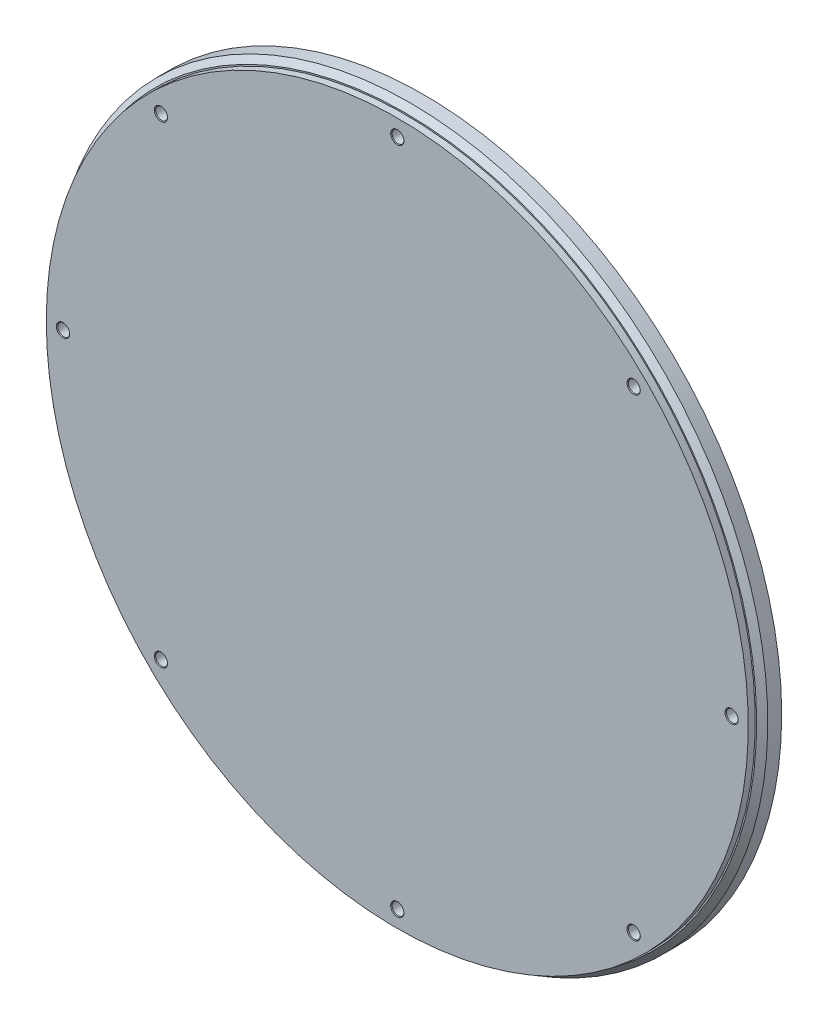
ISO-10303-21;
HEADER;
FILE_DESCRIPTION(('STEP AP214'),'2;1');
FILE_NAME('part.step','',(''),(''),'','','');
FILE_SCHEMA(('AUTOMOTIVE_DESIGN { 1 0 10303 214 1 1 1 1 }'));
ENDSEC;
DATA;
#1=APPLICATION_CONTEXT('core data for automotive mechanical design processes');
#2=APPLICATION_PROTOCOL_DEFINITION('international standard','automotive_design',2000,#1);
#3=PRODUCT_CONTEXT('',#1,'mechanical');
#4=PRODUCT('Part','Part','',(#3));
#5=PRODUCT_RELATED_PRODUCT_CATEGORY('part','',(#4));
#6=PRODUCT_DEFINITION_FORMATION('','',#4);
#7=PRODUCT_DEFINITION_CONTEXT('part definition',#1,'design');
#8=PRODUCT_DEFINITION('design','',#6,#7);
#9=PRODUCT_DEFINITION_SHAPE('','',#8);
#10=(LENGTH_UNIT() NAMED_UNIT(*) SI_UNIT(.MILLI.,.METRE.));
#11=(NAMED_UNIT(*) PLANE_ANGLE_UNIT() SI_UNIT($,.RADIAN.));
#12=(NAMED_UNIT(*) SI_UNIT($,.STERADIAN.) SOLID_ANGLE_UNIT());
#13=UNCERTAINTY_MEASURE_WITH_UNIT(LENGTH_MEASURE(1.E-05),#10,'distance_accuracy_value','');
#14=(GEOMETRIC_REPRESENTATION_CONTEXT(3) GLOBAL_UNCERTAINTY_ASSIGNED_CONTEXT((#13)) GLOBAL_UNIT_ASSIGNED_CONTEXT((#10,
#11,#12)) REPRESENTATION_CONTEXT('',''));
#15=CARTESIAN_POINT('',(0.,0.,0.));
#16=DIRECTION('',(0.,0.,1.));
#17=DIRECTION('',(1.,0.,0.));
#18=AXIS2_PLACEMENT_3D('',#15,#16,#17);
#19=CARTESIAN_POINT('',(0.,0.,8.40611909198));
#20=DIRECTION('',(0.,0.,-1.));
#21=DIRECTION('',(1.,0.,0.));
#22=AXIS2_PLACEMENT_3D('',#19,#20,#21);
#23=CONICAL_SURFACE('',#22,1.424104327826,1.02974425867665);
#24=DIRECTION('',(-0.857167300702112,0.,-0.515038074910054));
#25=VECTOR('',#24,1.);
#26=CARTESIAN_POINT('',(-1.424104327826,0.,8.40611909198));
#27=LINE('',#26,#25);
#28=CARTESIAN_POINT('',(0.,0.,9.261807299958));
#29=VERTEX_POINT('',#28);
#30=CARTESIAN_POINT('',(-2.1,0.,8.));
#31=VERTEX_POINT('',#30);
#32=EDGE_CURVE('E11',#29,#31,#27,.T.);
#33=ORIENTED_EDGE('',*,*,#32,.T.);
#34=CARTESIAN_POINT('',(0.,0.,8.));
#35=DIRECTION('',(0.,0.,-1.));
#36=DIRECTION('',(1.,0.,0.));
#37=AXIS2_PLACEMENT_3D('',#34,#35,#36);
#38=CIRCLE('',#37,2.1);
#39=EDGE_CURVE('E365',#31,#31,#38,.T.);
#40=ORIENTED_EDGE('',*,*,#39,.T.);
#41=ORIENTED_EDGE('',*,*,#32,.F.);
#42=EDGE_LOOP('',(#33,#40,#41));
#43=FACE_BOUND('',#42,.T.);
#44=ADVANCED_FACE('F17',(#43),#23,.F.);
#45=CARTESIAN_POINT('',(0.,0.,9.724897664956));
#46=DIRECTION('',(0.,0.,-1.));
#47=DIRECTION('',(1.,0.,0.));
#48=AXIS2_PLACEMENT_3D('',#45,#46,#47);
#49=CYLINDRICAL_SURFACE('',#48,2.1);
#50=ORIENTED_EDGE('',*,*,#39,.F.);
#51=DIRECTION('',(0.,0.,-1.));
#52=VECTOR('',#51,1.);
#53=CARTESIAN_POINT('',(-2.1,0.,9.724897664956));
#54=LINE('',#53,#52);
#55=CARTESIAN_POINT('',(-2.1,0.,0.));
#56=VERTEX_POINT('',#55);
#57=EDGE_CURVE('E28',#31,#56,#54,.T.);
#58=ORIENTED_EDGE('',*,*,#57,.T.);
#59=CARTESIAN_POINT('',(0.,0.,0.));
#60=DIRECTION('',(0.,0.,-1.));
#61=DIRECTION('',(1.,0.,0.));
#62=AXIS2_PLACEMENT_3D('',#59,#60,#61);
#63=CIRCLE('',#62,2.1);
#64=EDGE_CURVE('E399',#56,#56,#63,.T.);
#65=ORIENTED_EDGE('',*,*,#64,.T.);
#66=ORIENTED_EDGE('',*,*,#57,.F.);
#67=EDGE_LOOP('',(#50,#58,#65,#66));
#68=FACE_BOUND('',#67,.T.);
#69=ADVANCED_FACE('F934',(#68),#49,.F.);
#70=CARTESIAN_POINT('',(169.7056274848,-169.7056274848,5.947955742565));
#71=DIRECTION('',(0.,0.,1.));
#72=DIRECTION('',(-0.707106781186548,0.707106781186548,0.));
#73=AXIS2_PLACEMENT_3D('',#70,#71,#72);
#74=CONICAL_SURFACE('',#73,2.499104327826,1.02974425867665);
#75=DIRECTION('',(0.606108810937832,-0.606108810937832,0.515038074910054));
#76=VECTOR('',#75,1.);
#77=CARTESIAN_POINT('',(171.472761101898,-171.472761101898,5.947955742565));
#78=LINE('',#77,#76);
#79=CARTESIAN_POINT('',(169.7056274848,-169.7056274848,4.446342369133));
#80=VERTEX_POINT('',#79);
#81=CARTESIAN_POINT('',(172.710831304843,-172.710831304843,7.));
#82=VERTEX_POINT('',#81);
#83=EDGE_CURVE('E378',#80,#82,#78,.T.);
#84=ORIENTED_EDGE('',*,*,#83,.T.);
#85=CARTESIAN_POINT('',(169.7056274848,-169.7056274848,7.));
#86=DIRECTION('',(0.,0.,1.));
#87=DIRECTION('',(-0.707106781186548,0.707106781186548,0.));
#88=AXIS2_PLACEMENT_3D('',#85,#86,#87);
#89=CIRCLE('',#88,4.25);
#90=EDGE_CURVE('E372',#82,#82,#89,.T.);
#91=ORIENTED_EDGE('',*,*,#90,.T.);
#92=ORIENTED_EDGE('',*,*,#83,.F.);
#93=EDGE_LOOP('',(#84,#91,#92));
#94=FACE_BOUND('',#93,.T.);
#95=ADVANCED_FACE('F924',(#94),#74,.F.);
#96=CARTESIAN_POINT('',(169.7056274848,-169.7056274848,3.71865948759));
#97=DIRECTION('',(0.,0.,1.));
#98=DIRECTION('',(-0.707106781186548,0.707106781186548,0.));
#99=AXIS2_PLACEMENT_3D('',#96,#97,#98);
#100=CYLINDRICAL_SURFACE('',#99,4.25);
#101=ORIENTED_EDGE('',*,*,#90,.F.);
#102=DIRECTION('',(0.,0.,1.));
#103=VECTOR('',#102,1.);
#104=CARTESIAN_POINT('',(172.710831304843,-172.710831304843,3.71865948759));
#105=LINE('',#104,#103);
#106=CARTESIAN_POINT('',(172.7108313048,-172.7108313048,18.5));
#107=VERTEX_POINT('',#106);
#108=EDGE_CURVE('E381',#82,#107,#105,.T.);
#109=ORIENTED_EDGE('',*,*,#108,.T.);
#110=CARTESIAN_POINT('',(169.7056274848,-169.7056274848,18.5));
#111=DIRECTION('',(0.,0.,-1.));
#112=DIRECTION('',(-0.707106781186548,0.707106781186548,0.));
#113=AXIS2_PLACEMENT_3D('',#110,#111,#112);
#114=CIRCLE('',#113,4.25);
#115=CARTESIAN_POINT('',(169.7056274848,-165.455627484798,18.4999999999975));
#116=VERTEX_POINT('',#115);
#117=EDGE_CURVE('E357',#116,#107,#114,.T.);
#118=ORIENTED_EDGE('',*,*,#117,.F.);
#119=CARTESIAN_POINT('',(169.7056274848,-169.7056274848,18.5));
#120=DIRECTION('',(0.,0.,-1.));
#121=DIRECTION('',(-0.707106781186548,0.707106781186548,0.));
#122=AXIS2_PLACEMENT_3D('',#119,#120,#121);
#123=CIRCLE('',#122,4.25);
#124=EDGE_CURVE('E316',#107,#116,#123,.T.);
#125=ORIENTED_EDGE('',*,*,#124,.F.);
#126=ORIENTED_EDGE('',*,*,#108,.F.);
#127=EDGE_LOOP('',(#101,#109,#118,#125,#126));
#128=FACE_BOUND('',#127,.T.);
#129=ADVANCED_FACE('F915',(#128),#100,.F.);
#130=CARTESIAN_POINT('',(169.7056274848,-169.7056274848,18.74999999081));
#131=DIRECTION('',(0.,0.,1.));
#132=DIRECTION('',(0.,-1.,0.));
#133=AXIS2_PLACEMENT_3D('',#130,#131,#132);
#134=CONICAL_SURFACE('',#133,4.499999990815,0.785398163397448);
#135=ORIENTED_EDGE('',*,*,#124,.T.);
#136=DIRECTION('',(0.,0.707106781186548,0.707106781186548));
#137=VECTOR('',#136,1.);
#138=CARTESIAN_POINT('',(169.7056274848,-165.205627493985,18.74999999081));
#139=LINE('',#138,#137);
#140=CARTESIAN_POINT('',(169.7056274848,-164.955627484798,18.9999999999975));
#141=VERTEX_POINT('',#140);
#142=EDGE_CURVE('E320',#116,#141,#139,.T.);
#143=ORIENTED_EDGE('',*,*,#142,.T.);
#144=CARTESIAN_POINT('',(169.7056274848,-169.7056274848,19.));
#145=DIRECTION('',(0.,0.,-1.));
#146=DIRECTION('',(-0.707106781186548,0.707106781186548,0.));
#147=AXIS2_PLACEMENT_3D('',#144,#145,#146);
#148=CIRCLE('',#147,4.75);
#149=EDGE_CURVE('E310',#141,#141,#148,.T.);
#150=ORIENTED_EDGE('',*,*,#149,.F.);
#151=ORIENTED_EDGE('',*,*,#142,.F.);
#152=ORIENTED_EDGE('',*,*,#117,.T.);
#153=EDGE_LOOP('',(#135,#143,#150,#151,#152));
#154=FACE_BOUND('',#153,.T.);
#155=ADVANCED_FACE('F905',(#154),#134,.F.);
#156=CARTESIAN_POINT('',(0.,-240.,5.947955742565));
#157=DIRECTION('',(0.,0.,1.));
#158=DIRECTION('',(0.,1.,0.));
#159=AXIS2_PLACEMENT_3D('',#156,#157,#158);
#160=CONICAL_SURFACE('',#159,2.499104327826,1.02974425867665);
#161=DIRECTION('',(0.,-0.857167300702112,0.515038074910054));
#162=VECTOR('',#161,1.);
#163=CARTESIAN_POINT('',(0.,-242.499104327826,5.947955742565));
#164=LINE('',#163,#162);
#165=CARTESIAN_POINT('',(0.,-240.,4.446342369133));
#166=VERTEX_POINT('',#165);
#167=CARTESIAN_POINT('',(0.,-244.25,7.));
#168=VERTEX_POINT('',#167);
#169=EDGE_CURVE('E290',#166,#168,#164,.T.);
#170=ORIENTED_EDGE('',*,*,#169,.T.);
#171=CARTESIAN_POINT('',(0.,-240.,7.));
#172=DIRECTION('',(0.,0.,1.));
#173=DIRECTION('',(0.,1.,0.));
#174=AXIS2_PLACEMENT_3D('',#171,#172,#173);
#175=CIRCLE('',#174,4.25);
#176=EDGE_CURVE('E291',#168,#168,#175,.T.);
#177=ORIENTED_EDGE('',*,*,#176,.T.);
#178=ORIENTED_EDGE('',*,*,#169,.F.);
#179=EDGE_LOOP('',(#170,#177,#178));
#180=FACE_BOUND('',#179,.T.);
#181=ADVANCED_FACE('F896',(#180),#160,.F.);
#182=CARTESIAN_POINT('',(0.,-240.,3.71865948759));
#183=DIRECTION('',(0.,0.,1.));
#184=DIRECTION('',(0.,1.,0.));
#185=AXIS2_PLACEMENT_3D('',#182,#183,#184);
#186=CYLINDRICAL_SURFACE('',#185,4.25);
#187=ORIENTED_EDGE('',*,*,#176,.F.);
#188=DIRECTION('',(0.,0.,1.));
#189=VECTOR('',#188,1.);
#190=CARTESIAN_POINT('',(0.,-244.25,3.71865948759));
#191=LINE('',#190,#189);
#192=CARTESIAN_POINT('',(0.,-244.25,18.5));
#193=VERTEX_POINT('',#192);
#194=EDGE_CURVE('E287',#168,#193,#191,.T.);
#195=ORIENTED_EDGE('',*,*,#194,.T.);
#196=CARTESIAN_POINT('',(0.,-240.,18.5));
#197=DIRECTION('',(0.,0.,-1.));
#198=DIRECTION('',(0.,1.,0.));
#199=AXIS2_PLACEMENT_3D('',#196,#197,#198);
#200=CIRCLE('',#199,4.25);
#201=CARTESIAN_POINT('',(0.,-235.75,18.4999999999985));
#202=VERTEX_POINT('',#201);
#203=EDGE_CURVE('E344',#202,#193,#200,.T.);
#204=ORIENTED_EDGE('',*,*,#203,.F.);
#205=CARTESIAN_POINT('',(0.,-240.,18.5));
#206=DIRECTION('',(0.,0.,-1.));
#207=DIRECTION('',(0.,1.,0.));
#208=AXIS2_PLACEMENT_3D('',#205,#206,#207);
#209=CIRCLE('',#208,4.25);
#210=EDGE_CURVE('E412',#193,#202,#209,.T.);
#211=ORIENTED_EDGE('',*,*,#210,.F.);
#212=ORIENTED_EDGE('',*,*,#194,.F.);
#213=EDGE_LOOP('',(#187,#195,#204,#211,#212));
#214=FACE_BOUND('',#213,.T.);
#215=ADVANCED_FACE('F886',(#214),#186,.F.);
#216=CARTESIAN_POINT('',(0.,-240.,18.74999988051));
#217=DIRECTION('',(0.,0.,1.));
#218=DIRECTION('',(0.,-1.,0.));
#219=AXIS2_PLACEMENT_3D('',#216,#217,#218);
#220=CONICAL_SURFACE('',#219,4.499999880513,0.785398163397448);
#221=ORIENTED_EDGE('',*,*,#210,.T.);
#222=DIRECTION('',(0.,0.707106781186548,0.707106781186548));
#223=VECTOR('',#222,1.);
#224=CARTESIAN_POINT('',(0.,-235.500000119487,18.74999988051));
#225=LINE('',#224,#223);
#226=CARTESIAN_POINT('',(0.,-235.25,18.9999999999985));
#227=VERTEX_POINT('',#226);
#228=EDGE_CURVE('E408',#202,#227,#225,.T.);
#229=ORIENTED_EDGE('',*,*,#228,.T.);
#230=CARTESIAN_POINT('',(0.,-240.,19.));
#231=DIRECTION('',(0.,0.,-1.));
#232=DIRECTION('',(0.,1.,0.));
#233=AXIS2_PLACEMENT_3D('',#230,#231,#232);
#234=CIRCLE('',#233,4.75);
#235=EDGE_CURVE('E315',#227,#227,#234,.T.);
#236=ORIENTED_EDGE('',*,*,#235,.F.);
#237=ORIENTED_EDGE('',*,*,#228,.F.);
#238=ORIENTED_EDGE('',*,*,#203,.T.);
#239=EDGE_LOOP('',(#221,#229,#236,#237,#238));
#240=FACE_BOUND('',#239,.T.);
#241=ADVANCED_FACE('F459',(#240),#220,.F.);
#242=CARTESIAN_POINT('',(-169.7056274848,-169.7056274848,5.947955742565));
#243=DIRECTION('',(0.,0.,1.));
#244=DIRECTION('',(0.707106781186548,0.707106781186548,0.));
#245=AXIS2_PLACEMENT_3D('',#242,#243,#244);
#246=CONICAL_SURFACE('',#245,2.499104327826,1.02974425867665);
#247=DIRECTION('',(-0.606108810937832,-0.606108810937832,0.515038074910054));
#248=VECTOR('',#247,1.);
#249=CARTESIAN_POINT('',(-171.472761101898,-171.472761101898,5.947955742565));
#250=LINE('',#249,#248);
#251=CARTESIAN_POINT('',(-169.7056274848,-169.7056274848,4.446342369133));
#252=VERTEX_POINT('',#251);
#253=CARTESIAN_POINT('',(-172.710831304843,-172.710831304843,7.));
#254=VERTEX_POINT('',#253);
#255=EDGE_CURVE('E376',#252,#254,#250,.T.);
#256=ORIENTED_EDGE('',*,*,#255,.T.);
#257=CARTESIAN_POINT('',(-169.7056274848,-169.7056274848,7.));
#258=DIRECTION('',(0.,0.,1.));
#259=DIRECTION('',(0.707106781186548,0.707106781186548,0.));
#260=AXIS2_PLACEMENT_3D('',#257,#258,#259);
#261=CIRCLE('',#260,4.25);
#262=EDGE_CURVE('E377',#254,#254,#261,.T.);
#263=ORIENTED_EDGE('',*,*,#262,.T.);
#264=ORIENTED_EDGE('',*,*,#255,.F.);
#265=EDGE_LOOP('',(#256,#263,#264));
#266=FACE_BOUND('',#265,.T.);
#267=ADVANCED_FACE('F867',(#266),#246,.F.);
#268=CARTESIAN_POINT('',(-169.7056274848,-169.7056274848,3.71865948759));
#269=DIRECTION('',(0.,0.,1.));
#270=DIRECTION('',(0.707106781186548,0.707106781186548,0.));
#271=AXIS2_PLACEMENT_3D('',#268,#269,#270);
#272=CYLINDRICAL_SURFACE('',#271,4.25);
#273=ORIENTED_EDGE('',*,*,#262,.F.);
#274=DIRECTION('',(0.,0.,1.));
#275=VECTOR('',#274,1.);
#276=CARTESIAN_POINT('',(-172.710831304843,-172.710831304843,3.71865948759));
#277=LINE('',#276,#275);
#278=CARTESIAN_POINT('',(-172.7108313048,-172.7108313048,18.5));
#279=VERTEX_POINT('',#278);
#280=EDGE_CURVE('E373',#254,#279,#277,.T.);
#281=ORIENTED_EDGE('',*,*,#280,.T.);
#282=CARTESIAN_POINT('',(-169.7056274848,-169.7056274848,18.5));
#283=DIRECTION('',(0.,0.,-1.));
#284=DIRECTION('',(0.707106781186548,0.707106781186548,0.));
#285=AXIS2_PLACEMENT_3D('',#282,#283,#284);
#286=CIRCLE('',#285,4.25);
#287=CARTESIAN_POINT('',(-169.7056274848,-165.455627484798,18.4999999999975));
#288=VERTEX_POINT('',#287);
#289=EDGE_CURVE('E339',#288,#279,#286,.T.);
#290=ORIENTED_EDGE('',*,*,#289,.F.);
#291=CARTESIAN_POINT('',(-169.7056274848,-169.7056274848,18.5));
#292=DIRECTION('',(0.,0.,-1.));
#293=DIRECTION('',(0.707106781186548,0.707106781186548,0.));
#294=AXIS2_PLACEMENT_3D('',#291,#292,#293);
#295=CIRCLE('',#294,4.25);
#296=EDGE_CURVE('E340',#279,#288,#295,.T.);
#297=ORIENTED_EDGE('',*,*,#296,.F.);
#298=ORIENTED_EDGE('',*,*,#280,.F.);
#299=EDGE_LOOP('',(#273,#281,#290,#297,#298));
#300=FACE_BOUND('',#299,.T.);
#301=ADVANCED_FACE('F856',(#300),#272,.F.);
#302=CARTESIAN_POINT('',(-169.7056274848,-169.7056274848,18.74999999081));
#303=DIRECTION('',(0.,0.,1.));
#304=DIRECTION('',(0.,-1.,0.));
#305=AXIS2_PLACEMENT_3D('',#302,#303,#304);
#306=CONICAL_SURFACE('',#305,4.499999990815,0.785398163397448);
#307=ORIENTED_EDGE('',*,*,#296,.T.);
#308=DIRECTION('',(0.,0.707106781186548,0.707106781186548));
#309=VECTOR('',#308,1.);
#310=CARTESIAN_POINT('',(-169.7056274848,-165.205627493985,18.74999999081));
#311=LINE('',#310,#309);
#312=CARTESIAN_POINT('',(-169.7056274848,-164.955627484798,18.9999999999975));
#313=VERTEX_POINT('',#312);
#314=EDGE_CURVE('E336',#288,#313,#311,.T.);
#315=ORIENTED_EDGE('',*,*,#314,.T.);
#316=CARTESIAN_POINT('',(-169.7056274848,-169.7056274848,19.));
#317=DIRECTION('',(0.,0.,-1.));
#318=DIRECTION('',(0.707106781186548,0.707106781186548,0.));
#319=AXIS2_PLACEMENT_3D('',#316,#317,#318);
#320=CIRCLE('',#319,4.75);
#321=EDGE_CURVE('E296',#313,#313,#320,.T.);
#322=ORIENTED_EDGE('',*,*,#321,.F.);
#323=ORIENTED_EDGE('',*,*,#314,.F.);
#324=ORIENTED_EDGE('',*,*,#289,.T.);
#325=EDGE_LOOP('',(#307,#315,#322,#323,#324));
#326=FACE_BOUND('',#325,.T.);
#327=ADVANCED_FACE('F844',(#326),#306,.F.);
#328=CARTESIAN_POINT('',(-240.,0.,5.947955742565));
#329=DIRECTION('',(0.,0.,1.));
#330=DIRECTION('',(1.,0.,0.));
#331=AXIS2_PLACEMENT_3D('',#328,#329,#330);
#332=CONICAL_SURFACE('',#331,2.499104327826,1.02974425867665);
#333=DIRECTION('',(-0.857167300702112,0.,0.515038074910054));
#334=VECTOR('',#333,1.);
#335=CARTESIAN_POINT('',(-242.499104327826,0.,5.947955742565));
#336=LINE('',#335,#334);
#337=CARTESIAN_POINT('',(-240.,0.,4.446342369133));
#338=VERTEX_POINT('',#337);
#339=CARTESIAN_POINT('',(-244.25,0.,7.));
#340=VERTEX_POINT('',#339);
#341=EDGE_CURVE('E360',#338,#340,#336,.T.);
#342=ORIENTED_EDGE('',*,*,#341,.T.);
#343=CARTESIAN_POINT('',(-240.,0.,7.));
#344=DIRECTION('',(0.,0.,-1.));
#345=DIRECTION('',(1.,0.,0.));
#346=AXIS2_PLACEMENT_3D('',#343,#344,#345);
#347=CIRCLE('',#346,4.25);
#348=EDGE_CURVE('E298',#340,#340,#347,.T.);
#349=ORIENTED_EDGE('',*,*,#348,.F.);
#350=ORIENTED_EDGE('',*,*,#341,.F.);
#351=EDGE_LOOP('',(#342,#349,#350));
#352=FACE_BOUND('',#351,.T.);
#353=ADVANCED_FACE('F833',(#352),#332,.F.);
#354=CARTESIAN_POINT('',(-240.,0.,3.71865948759));
#355=DIRECTION('',(0.,0.,1.));
#356=DIRECTION('',(1.,0.,0.));
#357=AXIS2_PLACEMENT_3D('',#354,#355,#356);
#358=CYLINDRICAL_SURFACE('',#357,4.25);
#359=ORIENTED_EDGE('',*,*,#348,.T.);
#360=DIRECTION('',(0.,0.,1.));
#361=VECTOR('',#360,1.);
#362=CARTESIAN_POINT('',(-244.25,0.,3.71865948759));
#363=LINE('',#362,#361);
#364=CARTESIAN_POINT('',(-244.25,0.,18.5));
#365=VERTEX_POINT('',#364);
#366=EDGE_CURVE('E302',#340,#365,#363,.T.);
#367=ORIENTED_EDGE('',*,*,#366,.T.);
#368=CARTESIAN_POINT('',(-240.,0.,18.5));
#369=DIRECTION('',(0.,0.,-1.));
#370=DIRECTION('',(-1.,0.,0.));
#371=AXIS2_PLACEMENT_3D('',#368,#369,#370);
#372=CIRCLE('',#371,4.25);
#373=CARTESIAN_POINT('',(-240.,4.25000000000152,18.4999999999985));
#374=VERTEX_POINT('',#373);
#375=EDGE_CURVE('E325',#374,#365,#372,.T.);
#376=ORIENTED_EDGE('',*,*,#375,.F.);
#377=CARTESIAN_POINT('',(-240.,0.,18.5));
#378=DIRECTION('',(0.,0.,-1.));
#379=DIRECTION('',(-1.,0.,0.));
#380=AXIS2_PLACEMENT_3D('',#377,#378,#379);
#381=CIRCLE('',#380,4.25);
#382=EDGE_CURVE('E328',#365,#374,#381,.T.);
#383=ORIENTED_EDGE('',*,*,#382,.F.);
#384=ORIENTED_EDGE('',*,*,#366,.F.);
#385=EDGE_LOOP('',(#359,#367,#376,#383,#384));
#386=FACE_BOUND('',#385,.T.);
#387=ADVANCED_FACE('F823',(#386),#358,.F.);
#388=CARTESIAN_POINT('',(-240.,0.,18.74999988051));
#389=DIRECTION('',(0.,0.,1.));
#390=DIRECTION('',(0.,-1.,0.));
#391=AXIS2_PLACEMENT_3D('',#388,#389,#390);
#392=CONICAL_SURFACE('',#391,4.499999880513,0.785398163397448);
#393=ORIENTED_EDGE('',*,*,#375,.T.);
#394=ORIENTED_EDGE('',*,*,#382,.T.);
#395=DIRECTION('',(0.,0.707106781186548,0.707106781186548));
#396=VECTOR('',#395,1.);
#397=CARTESIAN_POINT('',(-240.,4.49999988051302,18.74999988051));
#398=LINE('',#397,#396);
#399=CARTESIAN_POINT('',(-240.,4.75000000000153,18.9999999999985));
#400=VERTEX_POINT('',#399);
#401=EDGE_CURVE('E303',#374,#400,#398,.T.);
#402=ORIENTED_EDGE('',*,*,#401,.T.);
#403=CARTESIAN_POINT('',(-240.,0.,19.));
#404=DIRECTION('',(0.,0.,-1.));
#405=DIRECTION('',(-1.,0.,0.));
#406=AXIS2_PLACEMENT_3D('',#403,#404,#405);
#407=CIRCLE('',#406,4.75);
#408=EDGE_CURVE('E292',#400,#400,#407,.T.);
#409=ORIENTED_EDGE('',*,*,#408,.F.);
#410=ORIENTED_EDGE('',*,*,#401,.F.);
#411=EDGE_LOOP('',(#393,#394,#402,#409,#410));
#412=FACE_BOUND('',#411,.T.);
#413=ADVANCED_FACE('F813',(#412),#392,.F.);
#414=CARTESIAN_POINT('',(-169.7056274848,169.7056274848,5.947955742565));
#415=DIRECTION('',(0.,0.,1.));
#416=DIRECTION('',(0.707106781186548,-0.707106781186548,0.));
#417=AXIS2_PLACEMENT_3D('',#414,#415,#416);
#418=CONICAL_SURFACE('',#417,2.499104327826,1.02974425867665);
#419=DIRECTION('',(-0.606108810937832,0.606108810937832,0.515038074910054));
#420=VECTOR('',#419,1.);
#421=CARTESIAN_POINT('',(-171.472761101898,171.472761101898,5.947955742565));
#422=LINE('',#421,#420);
#423=CARTESIAN_POINT('',(-169.7056274848,169.7056274848,4.446342369133));
#424=VERTEX_POINT('',#423);
#425=CARTESIAN_POINT('',(-172.7108313048,172.7108313048,7.));
#426=VERTEX_POINT('',#425);
#427=EDGE_CURVE('E329',#424,#426,#422,.T.);
#428=ORIENTED_EDGE('',*,*,#427,.T.);
#429=CARTESIAN_POINT('',(-169.7056274848,169.7056274848,7.));
#430=DIRECTION('',(0.,0.,-1.));
#431=DIRECTION('',(0.707106781186548,-0.707106781186548,0.));
#432=AXIS2_PLACEMENT_3D('',#429,#430,#431);
#433=CIRCLE('',#432,4.25);
#434=EDGE_CURVE('E274',#426,#426,#433,.T.);
#435=ORIENTED_EDGE('',*,*,#434,.F.);
#436=ORIENTED_EDGE('',*,*,#427,.F.);
#437=EDGE_LOOP('',(#428,#435,#436));
#438=FACE_BOUND('',#437,.T.);
#439=ADVANCED_FACE('F802',(#438),#418,.F.);
#440=CARTESIAN_POINT('',(-169.7056274848,169.7056274848,3.71865948759));
#441=DIRECTION('',(0.,0.,1.));
#442=DIRECTION('',(0.707106781186548,-0.707106781186548,0.));
#443=AXIS2_PLACEMENT_3D('',#440,#441,#442);
#444=CYLINDRICAL_SURFACE('',#443,4.25);
#445=ORIENTED_EDGE('',*,*,#434,.T.);
#446=DIRECTION('',(0.,0.,1.));
#447=VECTOR('',#446,1.);
#448=CARTESIAN_POINT('',(-172.710831304843,172.710831304843,3.71865948759));
#449=LINE('',#448,#447);
#450=CARTESIAN_POINT('',(-172.710831304843,172.710831304843,18.5));
#451=VERTEX_POINT('',#450);
#452=EDGE_CURVE('E345',#426,#451,#449,.T.);
#453=ORIENTED_EDGE('',*,*,#452,.T.);
#454=CARTESIAN_POINT('',(-169.7056274848,169.7056274848,18.5));
#455=DIRECTION('',(0.,0.,-1.));
#456=DIRECTION('',(-0.707106781186548,0.707106781186548,0.));
#457=AXIS2_PLACEMENT_3D('',#454,#455,#456);
#458=CIRCLE('',#457,4.25);
#459=CARTESIAN_POINT('',(-169.7056274848,173.955627484803,18.4999999999975));
#460=VERTEX_POINT('',#459);
#461=EDGE_CURVE('E281',#460,#451,#458,.T.);
#462=ORIENTED_EDGE('',*,*,#461,.F.);
#463=CARTESIAN_POINT('',(-169.7056274848,169.7056274848,18.5));
#464=DIRECTION('',(0.,0.,-1.));
#465=DIRECTION('',(-0.707106781186548,0.707106781186548,0.));
#466=AXIS2_PLACEMENT_3D('',#463,#464,#465);
#467=CIRCLE('',#466,4.25);
#468=EDGE_CURVE('E284',#451,#460,#467,.T.);
#469=ORIENTED_EDGE('',*,*,#468,.F.);
#470=ORIENTED_EDGE('',*,*,#452,.F.);
#471=EDGE_LOOP('',(#445,#453,#462,#469,#470));
#472=FACE_BOUND('',#471,.T.);
#473=ADVANCED_FACE('F791',(#472),#444,.F.);
#474=CARTESIAN_POINT('',(-169.7056274848,169.7056274848,18.74999999081));
#475=DIRECTION('',(0.,0.,1.));
#476=DIRECTION('',(0.,-1.,0.));
#477=AXIS2_PLACEMENT_3D('',#474,#475,#476);
#478=CONICAL_SURFACE('',#477,4.499999990815,0.785398163397448);
#479=ORIENTED_EDGE('',*,*,#461,.T.);
#480=ORIENTED_EDGE('',*,*,#468,.T.);
#481=DIRECTION('',(0.,0.707106781186548,0.707106781186548));
#482=VECTOR('',#481,1.);
#483=CARTESIAN_POINT('',(-169.7056274848,174.205627475615,18.74999999081));
#484=LINE('',#483,#482);
#485=CARTESIAN_POINT('',(-169.7056274848,174.455627484803,18.9999999999975));
#486=VERTEX_POINT('',#485);
#487=EDGE_CURVE('E307',#460,#486,#484,.T.);
#488=ORIENTED_EDGE('',*,*,#487,.T.);
#489=CARTESIAN_POINT('',(-169.7056274848,169.7056274848,19.));
#490=DIRECTION('',(0.,0.,-1.));
#491=DIRECTION('',(-0.707106781186548,0.707106781186548,0.));
#492=AXIS2_PLACEMENT_3D('',#489,#490,#491);
#493=CIRCLE('',#492,4.75);
#494=EDGE_CURVE('E297',#486,#486,#493,.T.);
#495=ORIENTED_EDGE('',*,*,#494,.F.);
#496=ORIENTED_EDGE('',*,*,#487,.F.);
#497=EDGE_LOOP('',(#479,#480,#488,#495,#496));
#498=FACE_BOUND('',#497,.T.);
#499=ADVANCED_FACE('F780',(#498),#478,.F.);
#500=CARTESIAN_POINT('',(0.,240.,5.947955742565));
#501=DIRECTION('',(0.,0.,1.));
#502=DIRECTION('',(0.,-1.,0.));
#503=AXIS2_PLACEMENT_3D('',#500,#501,#502);
#504=CONICAL_SURFACE('',#503,2.499104327826,1.02974425867665);
#505=DIRECTION('',(0.,0.857167300702112,0.515038074910054));
#506=VECTOR('',#505,1.);
#507=CARTESIAN_POINT('',(0.,242.499104327826,5.947955742565));
#508=LINE('',#507,#506);
#509=CARTESIAN_POINT('',(0.,240.,4.446342369133));
#510=VERTEX_POINT('',#509);
#511=CARTESIAN_POINT('',(0.,244.25,7.));
#512=VERTEX_POINT('',#511);
#513=EDGE_CURVE('E285',#510,#512,#508,.T.);
#514=ORIENTED_EDGE('',*,*,#513,.T.);
#515=CARTESIAN_POINT('',(0.,240.,7.));
#516=DIRECTION('',(0.,0.,-1.));
#517=DIRECTION('',(0.,-1.,0.));
#518=AXIS2_PLACEMENT_3D('',#515,#516,#517);
#519=CIRCLE('',#518,4.25);
#520=EDGE_CURVE('E351',#512,#512,#519,.T.);
#521=ORIENTED_EDGE('',*,*,#520,.F.);
#522=ORIENTED_EDGE('',*,*,#513,.F.);
#523=EDGE_LOOP('',(#514,#521,#522));
#524=FACE_BOUND('',#523,.T.);
#525=ADVANCED_FACE('F771',(#524),#504,.F.);
#526=CARTESIAN_POINT('',(0.,240.,3.71865948759));
#527=DIRECTION('',(0.,0.,1.));
#528=DIRECTION('',(0.,-1.,0.));
#529=AXIS2_PLACEMENT_3D('',#526,#527,#528);
#530=CYLINDRICAL_SURFACE('',#529,4.25);
#531=ORIENTED_EDGE('',*,*,#520,.T.);
#532=DIRECTION('',(0.,0.,1.));
#533=VECTOR('',#532,1.);
#534=CARTESIAN_POINT('',(0.,244.25,3.71865948759));
#535=LINE('',#534,#533);
#536=CARTESIAN_POINT('',(0.,244.25,18.4999999999985));
#537=VERTEX_POINT('',#536);
#538=EDGE_CURVE('E350',#512,#537,#535,.T.);
#539=ORIENTED_EDGE('',*,*,#538,.T.);
#540=CARTESIAN_POINT('',(0.,240.,18.5));
#541=DIRECTION('',(0.,0.,-1.));
#542=DIRECTION('',(0.,1.,0.));
#543=AXIS2_PLACEMENT_3D('',#540,#541,#542);
#544=CIRCLE('',#543,4.25);
#545=EDGE_CURVE('E276',#537,#537,#544,.T.);
#546=ORIENTED_EDGE('',*,*,#545,.F.);
#547=ORIENTED_EDGE('',*,*,#538,.F.);
#548=EDGE_LOOP('',(#531,#539,#546,#547));
#549=FACE_BOUND('',#548,.T.);
#550=ADVANCED_FACE('F496',(#549),#530,.F.);
#551=CARTESIAN_POINT('',(0.,240.,18.74999988051));
#552=DIRECTION('',(0.,0.,1.));
#553=DIRECTION('',(0.,-1.,0.));
#554=AXIS2_PLACEMENT_3D('',#551,#552,#553);
#555=CONICAL_SURFACE('',#554,4.499999880513,0.785398163397448);
#556=ORIENTED_EDGE('',*,*,#545,.T.);
#557=DIRECTION('',(0.,0.707106781186548,0.707106781186548));
#558=VECTOR('',#557,1.);
#559=CARTESIAN_POINT('',(0.,244.499999880513,18.74999988051));
#560=LINE('',#559,#558);
#561=CARTESIAN_POINT('',(0.,244.75,18.9999999999985));
#562=VERTEX_POINT('',#561);
#563=EDGE_CURVE('E280',#537,#562,#560,.T.);
#564=ORIENTED_EDGE('',*,*,#563,.T.);
#565=CARTESIAN_POINT('',(0.,240.,19.));
#566=DIRECTION('',(0.,0.,-1.));
#567=DIRECTION('',(0.,1.,0.));
#568=AXIS2_PLACEMENT_3D('',#565,#566,#567);
#569=CIRCLE('',#568,4.75);
#570=EDGE_CURVE('E331',#562,#562,#569,.T.);
#571=ORIENTED_EDGE('',*,*,#570,.F.);
#572=ORIENTED_EDGE('',*,*,#563,.F.);
#573=EDGE_LOOP('',(#556,#564,#571,#572));
#574=FACE_BOUND('',#573,.T.);
#575=ADVANCED_FACE('F500',(#574),#555,.F.);
#576=CARTESIAN_POINT('',(169.7056274848,169.7056274848,5.947955742565));
#577=DIRECTION('',(0.,0.,1.));
#578=DIRECTION('',(-0.707106781186548,-0.707106781186548,0.));
#579=AXIS2_PLACEMENT_3D('',#576,#577,#578);
#580=CONICAL_SURFACE('',#579,2.499104327826,1.02974425867665);
#581=DIRECTION('',(0.606108810937832,0.606108810937832,0.515038074910054));
#582=VECTOR('',#581,1.);
#583=CARTESIAN_POINT('',(171.472761101898,171.472761101898,5.947955742565));
#584=LINE('',#583,#582);
#585=CARTESIAN_POINT('',(169.7056274848,169.7056274848,4.446342369133));
#586=VERTEX_POINT('',#585);
#587=CARTESIAN_POINT('',(172.710831304843,172.710831304843,7.));
#588=VERTEX_POINT('',#587);
#589=EDGE_CURVE('E252',#586,#588,#584,.T.);
#590=ORIENTED_EDGE('',*,*,#589,.T.);
#591=CARTESIAN_POINT('',(169.7056274848,169.7056274848,7.));
#592=DIRECTION('',(0.,0.,1.));
#593=DIRECTION('',(-0.707106781186548,-0.707106781186548,0.));
#594=AXIS2_PLACEMENT_3D('',#591,#592,#593);
#595=CIRCLE('',#594,4.25);
#596=EDGE_CURVE('E250',#588,#588,#595,.T.);
#597=ORIENTED_EDGE('',*,*,#596,.T.);
#598=ORIENTED_EDGE('',*,*,#589,.F.);
#599=EDGE_LOOP('',(#590,#597,#598));
#600=FACE_BOUND('',#599,.T.);
#601=ADVANCED_FACE('F742',(#600),#580,.F.);
#602=CARTESIAN_POINT('',(169.7056274848,169.7056274848,3.71865948759));
#603=DIRECTION('',(0.,0.,1.));
#604=DIRECTION('',(-0.707106781186548,-0.707106781186548,0.));
#605=AXIS2_PLACEMENT_3D('',#602,#603,#604);
#606=CYLINDRICAL_SURFACE('',#605,4.25);
#607=ORIENTED_EDGE('',*,*,#596,.F.);
#608=DIRECTION('',(0.,0.,1.));
#609=VECTOR('',#608,1.);
#610=CARTESIAN_POINT('',(172.710831304843,172.710831304843,3.71865948759));
#611=LINE('',#610,#609);
#612=CARTESIAN_POINT('',(172.7108313048,172.7108313048,18.5));
#613=VERTEX_POINT('',#612);
#614=EDGE_CURVE('E243',#588,#613,#611,.T.);
#615=ORIENTED_EDGE('',*,*,#614,.T.);
#616=CARTESIAN_POINT('',(169.7056274848,169.7056274848,18.5));
#617=DIRECTION('',(0.,0.,-1.));
#618=DIRECTION('',(-0.707106781186548,-0.707106781186548,0.));
#619=AXIS2_PLACEMENT_3D('',#616,#617,#618);
#620=CIRCLE('',#619,4.25);
#621=CARTESIAN_POINT('',(169.7056274848,173.955627484803,18.4999999999975));
#622=VERTEX_POINT('',#621);
#623=EDGE_CURVE('E247',#622,#613,#620,.T.);
#624=ORIENTED_EDGE('',*,*,#623,.F.);
#625=CARTESIAN_POINT('',(169.7056274848,169.7056274848,18.5));
#626=DIRECTION('',(0.,0.,-1.));
#627=DIRECTION('',(-0.707106781186548,-0.707106781186548,0.));
#628=AXIS2_PLACEMENT_3D('',#625,#626,#627);
#629=CIRCLE('',#628,4.25);
#630=EDGE_CURVE('E257',#613,#622,#629,.T.);
#631=ORIENTED_EDGE('',*,*,#630,.F.);
#632=ORIENTED_EDGE('',*,*,#614,.F.);
#633=EDGE_LOOP('',(#607,#615,#624,#631,#632));
#634=FACE_BOUND('',#633,.T.);
#635=ADVANCED_FACE('F245',(#634),#606,.F.);
#636=CARTESIAN_POINT('',(169.7056274848,169.7056274848,18.74999999081));
#637=DIRECTION('',(0.,0.,1.));
#638=DIRECTION('',(0.,-1.,0.));
#639=AXIS2_PLACEMENT_3D('',#636,#637,#638);
#640=CONICAL_SURFACE('',#639,4.499999990815,0.785398163397448);
#641=ORIENTED_EDGE('',*,*,#630,.T.);
#642=DIRECTION('',(0.,0.707106781186548,0.707106781186548));
#643=VECTOR('',#642,1.);
#644=CARTESIAN_POINT('',(169.7056274848,174.205627475615,18.74999999081));
#645=LINE('',#644,#643);
#646=CARTESIAN_POINT('',(169.7056274848,174.455627484803,18.9999999999975));
#647=VERTEX_POINT('',#646);
#648=EDGE_CURVE('E259',#622,#647,#645,.T.);
#649=ORIENTED_EDGE('',*,*,#648,.T.);
#650=CARTESIAN_POINT('',(169.7056274848,169.7056274848,19.));
#651=DIRECTION('',(0.,0.,-1.));
#652=DIRECTION('',(-0.707106781186548,-0.707106781186548,0.));
#653=AXIS2_PLACEMENT_3D('',#650,#651,#652);
#654=CIRCLE('',#653,4.75);
#655=EDGE_CURVE('E335',#647,#647,#654,.T.);
#656=ORIENTED_EDGE('',*,*,#655,.F.);
#657=ORIENTED_EDGE('',*,*,#648,.F.);
#658=ORIENTED_EDGE('',*,*,#623,.T.);
#659=EDGE_LOOP('',(#641,#649,#656,#657,#658));
#660=FACE_BOUND('',#659,.T.);
#661=ADVANCED_FACE('F256',(#660),#640,.F.);
#662=CARTESIAN_POINT('',(240.,0.,5.947955742565));
#663=DIRECTION('',(0.,0.,1.));
#664=DIRECTION('',(-1.,0.,0.));
#665=AXIS2_PLACEMENT_3D('',#662,#663,#664);
#666=CONICAL_SURFACE('',#665,2.499104327826,1.02974425867665);
#667=DIRECTION('',(0.857167300702112,0.,0.515038074910054));
#668=VECTOR('',#667,1.);
#669=CARTESIAN_POINT('',(242.499104327826,0.,5.947955742565));
#670=LINE('',#669,#668);
#671=CARTESIAN_POINT('',(240.,0.,4.446342369133));
#672=VERTEX_POINT('',#671);
#673=CARTESIAN_POINT('',(244.25,0.,7.));
#674=VERTEX_POINT('',#673);
#675=EDGE_CURVE('E263',#672,#674,#670,.T.);
#676=ORIENTED_EDGE('',*,*,#675,.T.);
#677=CARTESIAN_POINT('',(240.,0.,7.));
#678=DIRECTION('',(0.,0.,1.));
#679=DIRECTION('',(-1.,0.,0.));
#680=AXIS2_PLACEMENT_3D('',#677,#678,#679);
#681=CIRCLE('',#680,4.25);
#682=EDGE_CURVE('E385',#674,#674,#681,.T.);
#683=ORIENTED_EDGE('',*,*,#682,.T.);
#684=ORIENTED_EDGE('',*,*,#675,.F.);
#685=EDGE_LOOP('',(#676,#683,#684));
#686=FACE_BOUND('',#685,.T.);
#687=ADVANCED_FACE('F712',(#686),#666,.F.);
#688=CARTESIAN_POINT('',(240.,0.,3.71865948759));
#689=DIRECTION('',(0.,0.,1.));
#690=DIRECTION('',(-1.,0.,0.));
#691=AXIS2_PLACEMENT_3D('',#688,#689,#690);
#692=CYLINDRICAL_SURFACE('',#691,4.25);
#693=ORIENTED_EDGE('',*,*,#682,.F.);
#694=DIRECTION('',(0.,0.,1.));
#695=VECTOR('',#694,1.);
#696=CARTESIAN_POINT('',(244.25,0.,3.71865948759));
#697=LINE('',#696,#695);
#698=CARTESIAN_POINT('',(244.25,0.,18.5));
#699=VERTEX_POINT('',#698);
#700=EDGE_CURVE('E185',#674,#699,#697,.T.);
#701=ORIENTED_EDGE('',*,*,#700,.T.);
#702=CARTESIAN_POINT('',(240.,0.,18.5));
#703=DIRECTION('',(0.,0.,-1.));
#704=DIRECTION('',(-1.,0.,0.));
#705=AXIS2_PLACEMENT_3D('',#702,#703,#704);
#706=CIRCLE('',#705,4.25);
#707=CARTESIAN_POINT('',(240.,4.2500000000015,18.4999999999985));
#708=VERTEX_POINT('',#707);
#709=EDGE_CURVE('E193',#708,#699,#706,.T.);
#710=ORIENTED_EDGE('',*,*,#709,.F.);
#711=CARTESIAN_POINT('',(240.,0.,18.5));
#712=DIRECTION('',(0.,0.,-1.));
#713=DIRECTION('',(-1.,0.,0.));
#714=AXIS2_PLACEMENT_3D('',#711,#712,#713);
#715=CIRCLE('',#714,4.25);
#716=EDGE_CURVE('E314',#699,#708,#715,.T.);
#717=ORIENTED_EDGE('',*,*,#716,.F.);
#718=ORIENTED_EDGE('',*,*,#700,.F.);
#719=EDGE_LOOP('',(#693,#701,#710,#717,#718));
#720=FACE_BOUND('',#719,.T.);
#721=ADVANCED_FACE('F700',(#720),#692,.F.);
#722=CARTESIAN_POINT('',(240.,0.,18.74999988051));
#723=DIRECTION('',(0.,0.,1.));
#724=DIRECTION('',(0.,-1.,0.));
#725=AXIS2_PLACEMENT_3D('',#722,#723,#724);
#726=CONICAL_SURFACE('',#725,4.499999880513,0.785398163397448);
#727=ORIENTED_EDGE('',*,*,#716,.T.);
#728=DIRECTION('',(0.,0.707106781186548,0.707106781186548));
#729=VECTOR('',#728,1.);
#730=CARTESIAN_POINT('',(240.,4.499999880513,18.74999988051));
#731=LINE('',#730,#729);
#732=CARTESIAN_POINT('',(240.,4.75000000000151,18.9999999999985));
#733=VERTEX_POINT('',#732);
#734=EDGE_CURVE('E405',#708,#733,#731,.T.);
#735=ORIENTED_EDGE('',*,*,#734,.T.);
#736=CARTESIAN_POINT('',(240.,0.,19.));
#737=DIRECTION('',(0.,0.,-1.));
#738=DIRECTION('',(-1.,0.,0.));
#739=AXIS2_PLACEMENT_3D('',#736,#737,#738);
#740=CIRCLE('',#739,4.75);
#741=EDGE_CURVE('E21',#733,#733,#740,.T.);
#742=ORIENTED_EDGE('',*,*,#741,.F.);
#743=ORIENTED_EDGE('',*,*,#734,.F.);
#744=ORIENTED_EDGE('',*,*,#709,.T.);
#745=EDGE_LOOP('',(#727,#735,#742,#743,#744));
#746=FACE_BOUND('',#745,.T.);
#747=ADVANCED_FACE('F687',(#746),#726,.F.);
#748=CARTESIAN_POINT('',(0.,0.,19.));
#749=DIRECTION('',(0.,0.,1.));
#750=DIRECTION('',(1.,0.,0.));
#751=AXIS2_PLACEMENT_3D('',#748,#749,#750);
#752=PLANE('',#751);
#753=ORIENTED_EDGE('',*,*,#149,.T.);
#754=EDGE_LOOP('',(#753));
#755=FACE_BOUND('',#754,.T.);
#756=ORIENTED_EDGE('',*,*,#235,.T.);
#757=EDGE_LOOP('',(#756));
#758=FACE_BOUND('',#757,.T.);
#759=ORIENTED_EDGE('',*,*,#321,.T.);
#760=EDGE_LOOP('',(#759));
#761=FACE_BOUND('',#760,.T.);
#762=ORIENTED_EDGE('',*,*,#408,.T.);
#763=EDGE_LOOP('',(#762));
#764=FACE_BOUND('',#763,.T.);
#765=ORIENTED_EDGE('',*,*,#494,.T.);
#766=EDGE_LOOP('',(#765));
#767=FACE_BOUND('',#766,.T.);
#768=ORIENTED_EDGE('',*,*,#570,.T.);
#769=EDGE_LOOP('',(#768));
#770=FACE_BOUND('',#769,.T.);
#771=ORIENTED_EDGE('',*,*,#655,.T.);
#772=EDGE_LOOP('',(#771));
#773=FACE_BOUND('',#772,.T.);
#774=ORIENTED_EDGE('',*,*,#741,.T.);
#775=EDGE_LOOP('',(#774));
#776=FACE_BOUND('',#775,.T.);
#777=CARTESIAN_POINT('',(0.,0.,19.));
#778=DIRECTION('',(0.,0.,1.));
#779=DIRECTION('',(-1.,0.,0.));
#780=AXIS2_PLACEMENT_3D('',#777,#778,#779);
#781=CIRCLE('',#780,252.);
#782=CARTESIAN_POINT('',(-252.,0.,19.));
#783=VERTEX_POINT('',#782);
#784=EDGE_CURVE('E306',#783,#783,#781,.T.);
#785=ORIENTED_EDGE('',*,*,#784,.T.);
#786=EDGE_LOOP('',(#785));
#787=FACE_BOUND('',#786,.T.);
#788=ADVANCED_FACE('F454',(#755,#758,#761,#764,#767,#770,#773,#776,#787),#752,.T.);
#789=CARTESIAN_POINT('',(0.,0.,19.));
#790=DIRECTION('',(0.,0.,1.));
#791=DIRECTION('',(1.,0.,0.));
#792=AXIS2_PLACEMENT_3D('',#789,#790,#791);
#793=CYLINDRICAL_SURFACE('',#792,252.);
#794=ORIENTED_EDGE('',*,*,#784,.F.);
#795=DIRECTION('',(0.,0.,-1.));
#796=VECTOR('',#795,1.);
#797=CARTESIAN_POINT('',(-252.,0.,19.));
#798=LINE('',#797,#796);
#799=CARTESIAN_POINT('',(-252.,0.,14.));
#800=VERTEX_POINT('',#799);
#801=EDGE_CURVE('E158',#783,#800,#798,.T.);
#802=ORIENTED_EDGE('',*,*,#801,.T.);
#803=CARTESIAN_POINT('',(0.,0.,14.));
#804=DIRECTION('',(0.,0.,-1.));
#805=DIRECTION('',(1.,0.,0.));
#806=AXIS2_PLACEMENT_3D('',#803,#804,#805);
#807=CIRCLE('',#806,252.);
#808=EDGE_CURVE('E382',#800,#800,#807,.T.);
#809=ORIENTED_EDGE('',*,*,#808,.F.);
#810=ORIENTED_EDGE('',*,*,#801,.F.);
#811=EDGE_LOOP('',(#794,#802,#809,#810));
#812=FACE_BOUND('',#811,.T.);
#813=ADVANCED_FACE('F19',(#812),#793,.T.);
#814=CARTESIAN_POINT('',(0.,0.,14.));
#815=DIRECTION('',(0.,0.,1.));
#816=DIRECTION('',(1.,0.,0.));
#817=AXIS2_PLACEMENT_3D('',#814,#815,#816);
#818=PLANE('',#817);
#819=ORIENTED_EDGE('',*,*,#808,.T.);
#820=EDGE_LOOP('',(#819));
#821=FACE_BOUND('',#820,.T.);
#822=CARTESIAN_POINT('',(0.,0.,14.));
#823=DIRECTION('',(0.,0.,-1.));
#824=DIRECTION('',(-1.,0.,0.));
#825=AXIS2_PLACEMENT_3D('',#822,#823,#824);
#826=CIRCLE('',#825,253.);
#827=CARTESIAN_POINT('',(0.,252.999999999985,13.999999999985));
#828=VERTEX_POINT('',#827);
#829=EDGE_CURVE('E171',#828,#828,#826,.T.);
#830=ORIENTED_EDGE('',*,*,#829,.F.);
#831=EDGE_LOOP('',(#830));
#832=FACE_BOUND('',#831,.T.);
#833=ADVANCED_FACE('F656',(#821,#832),#818,.T.);
#834=CARTESIAN_POINT('',(0.,0.,12.00000000047));
#835=DIRECTION('',(0.,0.,-1.));
#836=DIRECTION('',(0.,-1.,0.));
#837=AXIS2_PLACEMENT_3D('',#834,#835,#836);
#838=CONICAL_SURFACE('',#837,254.9999999995,0.785398163397448);
#839=CARTESIAN_POINT('',(0.,0.,10.));
#840=DIRECTION('',(0.,0.,-1.));
#841=DIRECTION('',(-1.,0.,0.));
#842=AXIS2_PLACEMENT_3D('',#839,#840,#841);
#843=CIRCLE('',#842,257.);
#844=CARTESIAN_POINT('',(-257.,0.,10.));
#845=VERTEX_POINT('',#844);
#846=CARTESIAN_POINT('',(0.,256.999999999985,9.99999999998499));
#847=VERTEX_POINT('',#846);
#848=EDGE_CURVE('E403',#845,#847,#843,.T.);
#849=ORIENTED_EDGE('',*,*,#848,.F.);
#850=CARTESIAN_POINT('',(0.,0.,10.));
#851=DIRECTION('',(0.,0.,-1.));
#852=DIRECTION('',(-1.,0.,0.));
#853=AXIS2_PLACEMENT_3D('',#850,#851,#852);
#854=CIRCLE('',#853,257.);
#855=EDGE_CURVE('E391',#847,#845,#854,.T.);
#856=ORIENTED_EDGE('',*,*,#855,.F.);
#857=DIRECTION('',(0.,-0.707106781186548,0.707106781186548));
#858=VECTOR('',#857,1.);
#859=CARTESIAN_POINT('',(0.,254.9999999995,12.00000000047));
#860=LINE('',#859,#858);
#861=EDGE_CURVE('E321',#847,#828,#860,.T.);
#862=ORIENTED_EDGE('',*,*,#861,.T.);
#863=ORIENTED_EDGE('',*,*,#829,.T.);
#864=ORIENTED_EDGE('',*,*,#861,.F.);
#865=EDGE_LOOP('',(#849,#856,#862,#863,#864));
#866=FACE_BOUND('',#865,.T.);
#867=ADVANCED_FACE('F644',(#866),#838,.T.);
#868=CARTESIAN_POINT('',(0.,0.,0.));
#869=DIRECTION('',(0.,0.,1.));
#870=DIRECTION('',(1.,0.,0.));
#871=AXIS2_PLACEMENT_3D('',#868,#869,#870);
#872=CYLINDRICAL_SURFACE('',#871,257.);
#873=ORIENTED_EDGE('',*,*,#848,.T.);
#874=ORIENTED_EDGE('',*,*,#855,.T.);
#875=DIRECTION('',(0.,0.,-1.));
#876=VECTOR('',#875,1.);
#877=CARTESIAN_POINT('',(-257.,0.,0.));
#878=LINE('',#877,#876);
#879=CARTESIAN_POINT('',(-257.,0.,0.));
#880=VERTEX_POINT('',#879);
#881=EDGE_CURVE('E324',#845,#880,#878,.T.);
#882=ORIENTED_EDGE('',*,*,#881,.T.);
#883=CARTESIAN_POINT('',(0.,0.,0.));
#884=DIRECTION('',(0.,0.,1.));
#885=DIRECTION('',(1.,0.,0.));
#886=AXIS2_PLACEMENT_3D('',#883,#884,#885);
#887=CIRCLE('',#886,257.);
#888=EDGE_CURVE('E404',#880,#880,#887,.T.);
#889=ORIENTED_EDGE('',*,*,#888,.T.);
#890=ORIENTED_EDGE('',*,*,#881,.F.);
#891=EDGE_LOOP('',(#873,#874,#882,#889,#890));
#892=FACE_BOUND('',#891,.T.);
#893=ADVANCED_FACE('F630',(#892),#872,.T.);
#894=CARTESIAN_POINT('',(0.,0.,0.));
#895=DIRECTION('',(0.,0.,1.));
#896=DIRECTION('',(1.,0.,0.));
#897=AXIS2_PLACEMENT_3D('',#894,#895,#896);
#898=PLANE('',#897);
#899=ORIENTED_EDGE('',*,*,#64,.F.);
#900=EDGE_LOOP('',(#899));
#901=FACE_BOUND('',#900,.T.);
#902=ORIENTED_EDGE('',*,*,#888,.F.);
#903=EDGE_LOOP('',(#902));
#904=FACE_BOUND('',#903,.T.);
#905=ADVANCED_FACE('F624',(#901,#904),#898,.F.);
#906=CLOSED_SHELL('',(#44,#69,#95,#129,#155,#181,#215,#241,#267,#301,#327,#353,#387,#413,#439,
#473,#499,#525,#550,#575,#601,#635,#661,#687,#721,#747,#788,#813,#833,#867,#893,#905));
#907=MANIFOLD_SOLID_BREP('B1',#906);
#908=ADVANCED_BREP_SHAPE_REPRESENTATION('',(#18,#907),#14);
#909=SHAPE_DEFINITION_REPRESENTATION(#9,#908);
ENDSEC;
END-ISO-10303-21;
